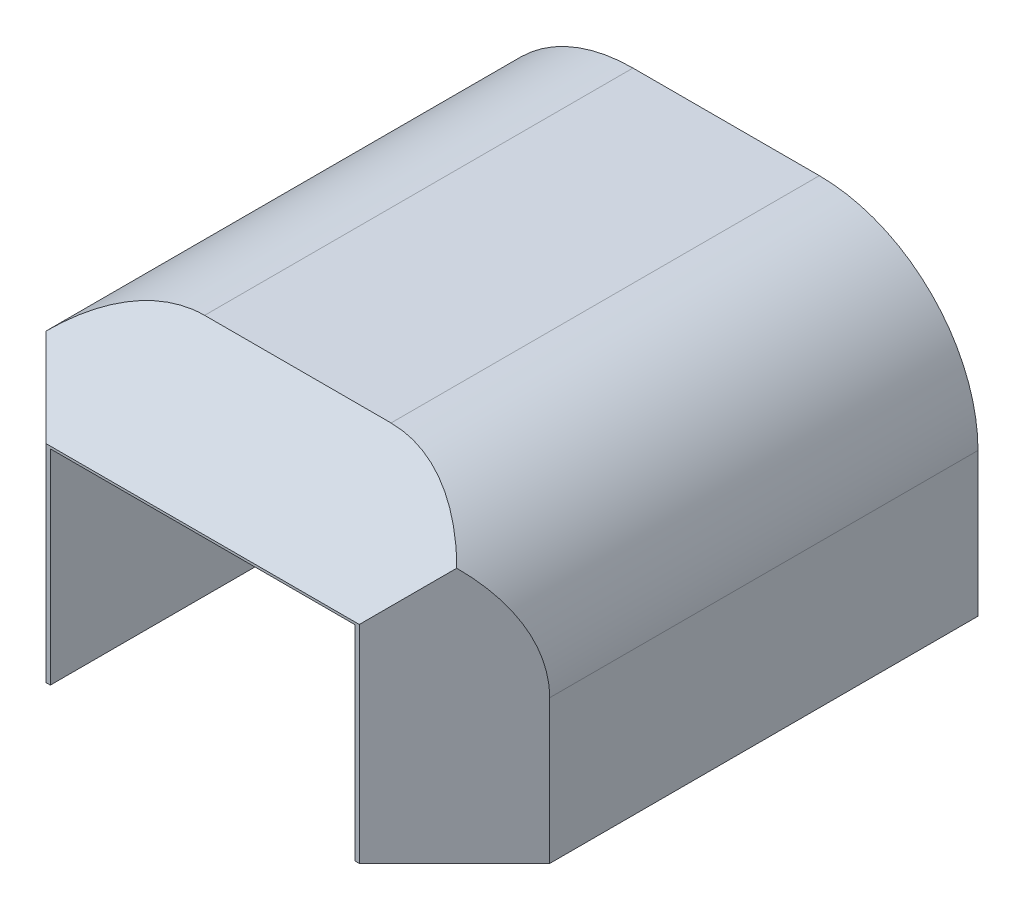
ISO-10303-21;
HEADER;
FILE_DESCRIPTION(('STEP AP214'),'2;1');
FILE_NAME('part.step','',(''),(''),'','','');
FILE_SCHEMA(('AUTOMOTIVE_DESIGN { 1 0 10303 214 1 1 1 1 }'));
ENDSEC;
DATA;
#1=APPLICATION_CONTEXT('core data for automotive mechanical design processes');
#2=APPLICATION_PROTOCOL_DEFINITION('international standard','automotive_design',2000,#1);
#3=PRODUCT_CONTEXT('',#1,'mechanical');
#4=PRODUCT('Part','Part','',(#3));
#5=PRODUCT_RELATED_PRODUCT_CATEGORY('part','',(#4));
#6=PRODUCT_DEFINITION_FORMATION('','',#4);
#7=PRODUCT_DEFINITION_CONTEXT('part definition',#1,'design');
#8=PRODUCT_DEFINITION('design','',#6,#7);
#9=PRODUCT_DEFINITION_SHAPE('','',#8);
#10=(LENGTH_UNIT() NAMED_UNIT(*) SI_UNIT(.MILLI.,.METRE.));
#11=(NAMED_UNIT(*) PLANE_ANGLE_UNIT() SI_UNIT($,.RADIAN.));
#12=(NAMED_UNIT(*) SI_UNIT($,.STERADIAN.) SOLID_ANGLE_UNIT());
#13=UNCERTAINTY_MEASURE_WITH_UNIT(LENGTH_MEASURE(1.E-05),#10,'distance_accuracy_value','');
#14=(GEOMETRIC_REPRESENTATION_CONTEXT(3) GLOBAL_UNCERTAINTY_ASSIGNED_CONTEXT((#13)) GLOBAL_UNIT_ASSIGNED_CONTEXT((#10,
#11,#12)) REPRESENTATION_CONTEXT('',''));
#15=CARTESIAN_POINT('',(0.,0.,0.));
#16=DIRECTION('',(0.,0.,1.));
#17=DIRECTION('',(1.,0.,0.));
#18=AXIS2_PLACEMENT_3D('',#15,#16,#17);
#19=CARTESIAN_POINT('',(0.,0.,16.5));
#20=DIRECTION('',(0.,-1.,0.));
#21=DIRECTION('',(1.,0.,0.));
#22=AXIS2_PLACEMENT_3D('',#19,#20,#21);
#23=PLANE('',#22);
#24=DIRECTION('',(0.,0.,-1.));
#25=VECTOR('',#24,1.);
#26=CARTESIAN_POINT('',(15.875,0.,16.5));
#27=LINE('',#26,#25);
#28=CARTESIAN_POINT('',(15.875,0.,10.5));
#29=VERTEX_POINT('',#28);
#30=CARTESIAN_POINT('',(15.875,0.,-16.5));
#31=VERTEX_POINT('',#30);
#32=EDGE_CURVE('E194',#29,#31,#27,.T.);
#33=ORIENTED_EDGE('',*,*,#32,.F.);
#34=DIRECTION('',(0.707106781186549,0.,-0.707106781186546));
#35=VECTOR('',#34,1.);
#36=CARTESIAN_POINT('',(4.93749999999997,0.,21.4375));
#37=LINE('',#36,#35);
#38=CARTESIAN_POINT('',(9.87499999999998,0.,16.5));
#39=VERTEX_POINT('',#38);
#40=EDGE_CURVE('E208',#29,#39,#37,.F.);
#41=ORIENTED_EDGE('',*,*,#40,.T.);
#42=DIRECTION('',(-1.,0.,0.));
#43=VECTOR('',#42,1.);
#44=CARTESIAN_POINT('',(0.,0.,16.5));
#45=LINE('',#44,#43);
#46=CARTESIAN_POINT('',(9.6,0.,16.5));
#47=VERTEX_POINT('',#46);
#48=EDGE_CURVE('E159',#39,#47,#45,.T.);
#49=ORIENTED_EDGE('',*,*,#48,.T.);
#50=DIRECTION('',(0.,0.,-1.));
#51=VECTOR('',#50,1.);
#52=CARTESIAN_POINT('',(9.6,0.,16.5));
#53=LINE('',#52,#51);
#54=CARTESIAN_POINT('',(9.6,0.,-16.5));
#55=VERTEX_POINT('',#54);
#56=EDGE_CURVE('E168',#47,#55,#53,.T.);
#57=ORIENTED_EDGE('',*,*,#56,.T.);
#58=DIRECTION('',(-1.,0.,0.));
#59=VECTOR('',#58,1.);
#60=CARTESIAN_POINT('',(0.,0.,-16.5));
#61=LINE('',#60,#59);
#62=EDGE_CURVE('E169',#31,#55,#61,.T.);
#63=ORIENTED_EDGE('',*,*,#62,.F.);
#64=EDGE_LOOP('',(#33,#41,#49,#57,#63));
#65=FACE_BOUND('',#64,.T.);
#66=ADVANCED_FACE('F39',(#65),#23,.T.);
#67=CARTESIAN_POINT('',(15.875,0.,16.5));
#68=DIRECTION('',(1.,0.,0.));
#69=DIRECTION('',(0.,0.,-1.));
#70=AXIS2_PLACEMENT_3D('',#67,#68,#69);
#71=PLANE('',#70);
#72=DIRECTION('',(0.,-1.,0.));
#73=VECTOR('',#72,1.);
#74=CARTESIAN_POINT('',(15.875,0.,-16.5));
#75=LINE('',#74,#73);
#76=CARTESIAN_POINT('',(15.875,9.05,-16.5));
#77=VERTEX_POINT('',#76);
#78=EDGE_CURVE('E172',#77,#31,#75,.T.);
#79=ORIENTED_EDGE('',*,*,#78,.F.);
#80=DIRECTION('',(0.,0.,-1.));
#81=VECTOR('',#80,1.);
#82=CARTESIAN_POINT('',(15.875,9.05,16.5));
#83=LINE('',#82,#81);
#84=CARTESIAN_POINT('',(15.875,9.05,10.5));
#85=VERTEX_POINT('',#84);
#86=EDGE_CURVE('E226',#77,#85,#83,.F.);
#87=ORIENTED_EDGE('',*,*,#86,.T.);
#88=DIRECTION('',(0.,-1.,0.));
#89=VECTOR('',#88,1.);
#90=CARTESIAN_POINT('',(15.875,0.,10.5));
#91=LINE('',#90,#89);
#92=EDGE_CURVE('E206',#85,#29,#91,.T.);
#93=ORIENTED_EDGE('',*,*,#92,.T.);
#94=ORIENTED_EDGE('',*,*,#32,.T.);
#95=EDGE_LOOP('',(#79,#87,#93,#94));
#96=FACE_BOUND('',#95,.T.);
#97=ADVANCED_FACE('F277',(#96),#71,.T.);
#98=CARTESIAN_POINT('',(0.,19.05,16.5));
#99=DIRECTION('',(0.,1.,0.));
#100=DIRECTION('',(-1.,0.,0.));
#101=AXIS2_PLACEMENT_3D('',#98,#99,#100);
#102=PLANE('',#101);
#103=DIRECTION('',(1.,0.,0.));
#104=VECTOR('',#103,1.);
#105=CARTESIAN_POINT('',(0.,19.05,10.5));
#106=LINE('',#105,#104);
#107=CARTESIAN_POINT('',(-5.875,19.05,10.5));
#108=VERTEX_POINT('',#107);
#109=CARTESIAN_POINT('',(5.875,19.05,10.5));
#110=VERTEX_POINT('',#109);
#111=EDGE_CURVE('E210',#108,#110,#106,.T.);
#112=ORIENTED_EDGE('',*,*,#111,.T.);
#113=DIRECTION('',(0.,0.,-1.));
#114=VECTOR('',#113,1.);
#115=CARTESIAN_POINT('',(5.875,19.05,16.5));
#116=LINE('',#115,#114);
#117=CARTESIAN_POINT('',(5.875,19.05,-16.5));
#118=VERTEX_POINT('',#117);
#119=EDGE_CURVE('E219',#110,#118,#116,.T.);
#120=ORIENTED_EDGE('',*,*,#119,.T.);
#121=DIRECTION('',(1.,0.,0.));
#122=VECTOR('',#121,1.);
#123=CARTESIAN_POINT('',(0.,19.05,-16.5));
#124=LINE('',#123,#122);
#125=CARTESIAN_POINT('',(-5.875,19.05,-16.5));
#126=VERTEX_POINT('',#125);
#127=EDGE_CURVE('E175',#126,#118,#124,.T.);
#128=ORIENTED_EDGE('',*,*,#127,.F.);
#129=DIRECTION('',(0.,0.,-1.));
#130=VECTOR('',#129,1.);
#131=CARTESIAN_POINT('',(-5.875,19.05,16.5));
#132=LINE('',#131,#130);
#133=EDGE_CURVE('E213',#126,#108,#132,.F.);
#134=ORIENTED_EDGE('',*,*,#133,.T.);
#135=EDGE_LOOP('',(#112,#120,#128,#134));
#136=FACE_BOUND('',#135,.T.);
#137=ADVANCED_FACE('F282',(#136),#102,.T.);
#138=CARTESIAN_POINT('',(-15.875,0.,16.5));
#139=DIRECTION('',(-1.,0.,0.));
#140=DIRECTION('',(0.,0.,1.));
#141=AXIS2_PLACEMENT_3D('',#138,#139,#140);
#142=PLANE('',#141);
#143=DIRECTION('',(0.,1.,0.));
#144=VECTOR('',#143,1.);
#145=CARTESIAN_POINT('',(-15.875,0.,10.5));
#146=LINE('',#145,#144);
#147=CARTESIAN_POINT('',(-15.875,0.,10.5));
#148=VERTEX_POINT('',#147);
#149=CARTESIAN_POINT('',(-15.875,9.05,10.5));
#150=VERTEX_POINT('',#149);
#151=EDGE_CURVE('E197',#148,#150,#146,.T.);
#152=ORIENTED_EDGE('',*,*,#151,.T.);
#153=DIRECTION('',(0.,0.,-1.));
#154=VECTOR('',#153,1.);
#155=CARTESIAN_POINT('',(-15.875,9.05,16.5));
#156=LINE('',#155,#154);
#157=CARTESIAN_POINT('',(-15.875,9.05,-16.5));
#158=VERTEX_POINT('',#157);
#159=EDGE_CURVE('E47',#150,#158,#156,.T.);
#160=ORIENTED_EDGE('',*,*,#159,.T.);
#161=DIRECTION('',(0.,1.,0.));
#162=VECTOR('',#161,1.);
#163=CARTESIAN_POINT('',(-15.875,0.,-16.5));
#164=LINE('',#163,#162);
#165=CARTESIAN_POINT('',(-15.875,0.,-16.5));
#166=VERTEX_POINT('',#165);
#167=EDGE_CURVE('E178',#166,#158,#164,.T.);
#168=ORIENTED_EDGE('',*,*,#167,.F.);
#169=DIRECTION('',(0.,0.,-1.));
#170=VECTOR('',#169,1.);
#171=CARTESIAN_POINT('',(-15.875,0.,16.5));
#172=LINE('',#171,#170);
#173=EDGE_CURVE('E145',#148,#166,#172,.T.);
#174=ORIENTED_EDGE('',*,*,#173,.F.);
#175=EDGE_LOOP('',(#152,#160,#168,#174));
#176=FACE_BOUND('',#175,.T.);
#177=ADVANCED_FACE('F236',(#176),#142,.T.);
#178=CARTESIAN_POINT('',(0.,0.,16.5));
#179=DIRECTION('',(0.,-1.,0.));
#180=DIRECTION('',(1.,0.,0.));
#181=AXIS2_PLACEMENT_3D('',#178,#179,#180);
#182=PLANE('',#181);
#183=DIRECTION('',(-1.,0.,0.));
#184=VECTOR('',#183,1.);
#185=CARTESIAN_POINT('',(0.,0.,16.5));
#186=LINE('',#185,#184);
#187=CARTESIAN_POINT('',(-9.6,0.,16.5));
#188=VERTEX_POINT('',#187);
#189=CARTESIAN_POINT('',(-9.87499999999998,0.,16.5));
#190=VERTEX_POINT('',#189);
#191=EDGE_CURVE('E139',#188,#190,#186,.T.);
#192=ORIENTED_EDGE('',*,*,#191,.T.);
#193=DIRECTION('',(0.707106781186549,0.,0.707106781186546));
#194=VECTOR('',#193,1.);
#195=CARTESIAN_POINT('',(-4.93749999999998,0.,21.4375));
#196=LINE('',#195,#194);
#197=EDGE_CURVE('E204',#190,#148,#196,.F.);
#198=ORIENTED_EDGE('',*,*,#197,.T.);
#199=ORIENTED_EDGE('',*,*,#173,.T.);
#200=DIRECTION('',(-1.,0.,0.));
#201=VECTOR('',#200,1.);
#202=CARTESIAN_POINT('',(0.,0.,-16.5));
#203=LINE('',#202,#201);
#204=CARTESIAN_POINT('',(-9.6,0.,-16.5));
#205=VERTEX_POINT('',#204);
#206=EDGE_CURVE('E142',#205,#166,#203,.T.);
#207=ORIENTED_EDGE('',*,*,#206,.F.);
#208=DIRECTION('',(0.,0.,-1.));
#209=VECTOR('',#208,1.);
#210=CARTESIAN_POINT('',(-9.6,0.,16.5));
#211=LINE('',#210,#209);
#212=EDGE_CURVE('E135',#188,#205,#211,.T.);
#213=ORIENTED_EDGE('',*,*,#212,.F.);
#214=EDGE_LOOP('',(#192,#198,#199,#207,#213));
#215=FACE_BOUND('',#214,.T.);
#216=ADVANCED_FACE('F137',(#215),#182,.T.);
#217=CARTESIAN_POINT('',(-9.6,0.,16.5));
#218=DIRECTION('',(-1.,0.,0.));
#219=DIRECTION('',(0.,0.,1.));
#220=AXIS2_PLACEMENT_3D('',#217,#218,#219);
#221=PLANE('',#220);
#222=DIRECTION('',(0.,1.,0.));
#223=VECTOR('',#222,1.);
#224=CARTESIAN_POINT('',(-9.6,0.,-16.5));
#225=LINE('',#224,#223);
#226=CARTESIAN_POINT('',(-9.6,12.9,-16.5));
#227=VERTEX_POINT('',#226);
#228=EDGE_CURVE('E182',#205,#227,#225,.T.);
#229=ORIENTED_EDGE('',*,*,#228,.T.);
#230=DIRECTION('',(0.,0.,-1.));
#231=VECTOR('',#230,1.);
#232=CARTESIAN_POINT('',(-9.6,12.9,16.5));
#233=LINE('',#232,#231);
#234=CARTESIAN_POINT('',(-9.6,12.9,16.5));
#235=VERTEX_POINT('',#234);
#236=EDGE_CURVE('E146',#235,#227,#233,.T.);
#237=ORIENTED_EDGE('',*,*,#236,.F.);
#238=DIRECTION('',(0.,1.,0.));
#239=VECTOR('',#238,1.);
#240=CARTESIAN_POINT('',(-9.6,0.,16.5));
#241=LINE('',#240,#239);
#242=EDGE_CURVE('E149',#188,#235,#241,.T.);
#243=ORIENTED_EDGE('',*,*,#242,.F.);
#244=ORIENTED_EDGE('',*,*,#212,.T.);
#245=EDGE_LOOP('',(#229,#237,#243,#244));
#246=FACE_BOUND('',#245,.T.);
#247=ADVANCED_FACE('F150',(#246),#221,.F.);
#248=CARTESIAN_POINT('',(0.,12.9,16.5));
#249=DIRECTION('',(0.,1.,0.));
#250=DIRECTION('',(0.,0.,1.));
#251=AXIS2_PLACEMENT_3D('',#248,#249,#250);
#252=PLANE('',#251);
#253=DIRECTION('',(1.,0.,0.));
#254=VECTOR('',#253,1.);
#255=CARTESIAN_POINT('',(0.,12.9,-16.5));
#256=LINE('',#255,#254);
#257=CARTESIAN_POINT('',(9.6,12.9,-16.5));
#258=VERTEX_POINT('',#257);
#259=EDGE_CURVE('E184',#227,#258,#256,.T.);
#260=ORIENTED_EDGE('',*,*,#259,.T.);
#261=DIRECTION('',(0.,0.,-1.));
#262=VECTOR('',#261,1.);
#263=CARTESIAN_POINT('',(9.6,12.9,16.5));
#264=LINE('',#263,#262);
#265=CARTESIAN_POINT('',(9.6,12.9,16.5));
#266=VERTEX_POINT('',#265);
#267=EDGE_CURVE('E189',#266,#258,#264,.T.);
#268=ORIENTED_EDGE('',*,*,#267,.F.);
#269=DIRECTION('',(1.,0.,0.));
#270=VECTOR('',#269,1.);
#271=CARTESIAN_POINT('',(0.,12.9,16.5));
#272=LINE('',#271,#270);
#273=EDGE_CURVE('E154',#235,#266,#272,.T.);
#274=ORIENTED_EDGE('',*,*,#273,.F.);
#275=ORIENTED_EDGE('',*,*,#236,.T.);
#276=EDGE_LOOP('',(#260,#268,#274,#275));
#277=FACE_BOUND('',#276,.T.);
#278=ADVANCED_FACE('F245',(#277),#252,.F.);
#279=CARTESIAN_POINT('',(9.6,0.,16.5));
#280=DIRECTION('',(1.,0.,0.));
#281=DIRECTION('',(0.,1.,0.));
#282=AXIS2_PLACEMENT_3D('',#279,#280,#281);
#283=PLANE('',#282);
#284=DIRECTION('',(0.,-1.,0.));
#285=VECTOR('',#284,1.);
#286=CARTESIAN_POINT('',(9.6,0.,-16.5));
#287=LINE('',#286,#285);
#288=EDGE_CURVE('E161',#258,#55,#287,.T.);
#289=ORIENTED_EDGE('',*,*,#288,.T.);
#290=ORIENTED_EDGE('',*,*,#56,.F.);
#291=DIRECTION('',(0.,-1.,0.));
#292=VECTOR('',#291,1.);
#293=CARTESIAN_POINT('',(9.6,0.,16.5));
#294=LINE('',#293,#292);
#295=EDGE_CURVE('E165',#266,#47,#294,.T.);
#296=ORIENTED_EDGE('',*,*,#295,.F.);
#297=ORIENTED_EDGE('',*,*,#267,.T.);
#298=EDGE_LOOP('',(#289,#290,#296,#297));
#299=FACE_BOUND('',#298,.T.);
#300=ADVANCED_FACE('F252',(#299),#283,.F.);
#301=CARTESIAN_POINT('',(0.,0.,16.5));
#302=DIRECTION('',(0.,0.,1.));
#303=DIRECTION('',(1.,0.,0.));
#304=AXIS2_PLACEMENT_3D('',#301,#302,#303);
#305=PLANE('',#304);
#306=DIRECTION('',(-1.,0.,0.));
#307=VECTOR('',#306,1.);
#308=CARTESIAN_POINT('',(0.,13.05,16.5));
#309=LINE('',#308,#307);
#310=CARTESIAN_POINT('',(9.87499999999998,13.05,16.5));
#311=VERTEX_POINT('',#310);
#312=CARTESIAN_POINT('',(-9.87499999999998,13.05,16.5));
#313=VERTEX_POINT('',#312);
#314=EDGE_CURVE('E199',#311,#313,#309,.T.);
#315=ORIENTED_EDGE('',*,*,#314,.T.);
#316=DIRECTION('',(0.,-1.,0.));
#317=VECTOR('',#316,1.);
#318=CARTESIAN_POINT('',(-9.87499999999998,0.,16.5));
#319=LINE('',#318,#317);
#320=EDGE_CURVE('E158',#313,#190,#319,.T.);
#321=ORIENTED_EDGE('',*,*,#320,.T.);
#322=ORIENTED_EDGE('',*,*,#191,.F.);
#323=ORIENTED_EDGE('',*,*,#242,.T.);
#324=ORIENTED_EDGE('',*,*,#273,.T.);
#325=ORIENTED_EDGE('',*,*,#295,.T.);
#326=ORIENTED_EDGE('',*,*,#48,.F.);
#327=DIRECTION('',(0.,1.,0.));
#328=VECTOR('',#327,1.);
#329=CARTESIAN_POINT('',(9.87499999999998,0.,16.5));
#330=LINE('',#329,#328);
#331=EDGE_CURVE('E201',#39,#311,#330,.T.);
#332=ORIENTED_EDGE('',*,*,#331,.T.);
#333=EDGE_LOOP('',(#315,#321,#322,#323,#324,#325,#326,#332));
#334=FACE_BOUND('',#333,.T.);
#335=ADVANCED_FACE('F156',(#334),#305,.T.);
#336=CARTESIAN_POINT('',(0.,0.,-16.5));
#337=DIRECTION('',(0.,0.,1.));
#338=DIRECTION('',(1.,0.,0.));
#339=AXIS2_PLACEMENT_3D('',#336,#337,#338);
#340=PLANE('',#339);
#341=ORIENTED_EDGE('',*,*,#127,.T.);
#342=CARTESIAN_POINT('',(5.875,9.05,-16.5));
#343=DIRECTION('',(0.,0.,1.));
#344=DIRECTION('',(1.,0.,0.));
#345=AXIS2_PLACEMENT_3D('',#342,#343,#344);
#346=CIRCLE('',#345,10.);
#347=EDGE_CURVE('E224',#118,#77,#346,.F.);
#348=ORIENTED_EDGE('',*,*,#347,.T.);
#349=ORIENTED_EDGE('',*,*,#78,.T.);
#350=ORIENTED_EDGE('',*,*,#62,.T.);
#351=ORIENTED_EDGE('',*,*,#288,.F.);
#352=ORIENTED_EDGE('',*,*,#259,.F.);
#353=ORIENTED_EDGE('',*,*,#228,.F.);
#354=ORIENTED_EDGE('',*,*,#206,.T.);
#355=ORIENTED_EDGE('',*,*,#167,.T.);
#356=CARTESIAN_POINT('',(-5.875,9.05,-16.5));
#357=DIRECTION('',(0.,0.,1.));
#358=DIRECTION('',(1.,0.,0.));
#359=AXIS2_PLACEMENT_3D('',#356,#357,#358);
#360=CIRCLE('',#359,10.);
#361=EDGE_CURVE('E222',#158,#126,#360,.F.);
#362=ORIENTED_EDGE('',*,*,#361,.T.);
#363=EDGE_LOOP('',(#341,#348,#349,#350,#351,#352,#353,#354,#355,#362));
#364=FACE_BOUND('',#363,.T.);
#365=ADVANCED_FACE('F240',(#364),#340,.F.);
#366=CARTESIAN_POINT('',(15.875,0.,10.5));
#367=DIRECTION('',(-0.707106781186546,0.,-0.707106781186549));
#368=DIRECTION('',(0.,-1.,0.));
#369=AXIS2_PLACEMENT_3D('',#366,#367,#368);
#370=PLANE('',#369);
#371=ORIENTED_EDGE('',*,*,#92,.F.);
#372=CARTESIAN_POINT('',(5.875,9.05,20.5));
#373=DIRECTION('',(-0.707106781186546,0.,-0.707106781186549));
#374=DIRECTION('',(0.707106781186549,0.,-0.707106781186546));
#375=AXIS2_PLACEMENT_3D('',#372,#373,#374);
#376=ELLIPSE('',#375,14.1421356237309,10.);
#377=CARTESIAN_POINT('',(12.9460678118655,16.1210678118655,13.4289321881345));
#378=VERTEX_POINT('',#377);
#379=EDGE_CURVE('E228',#85,#378,#376,.F.);
#380=ORIENTED_EDGE('',*,*,#379,.T.);
#381=DIRECTION('',(0.577350269189626,0.577350269189626,-0.577350269189624));
#382=VECTOR('',#381,1.);
#383=CARTESIAN_POINT('',(10.5833333333333,13.7583333333333,15.7916666666667));
#384=LINE('',#383,#382);
#385=EDGE_CURVE('E173',#311,#378,#384,.T.);
#386=ORIENTED_EDGE('',*,*,#385,.F.);
#387=ORIENTED_EDGE('',*,*,#331,.F.);
#388=ORIENTED_EDGE('',*,*,#40,.F.);
#389=EDGE_LOOP('',(#371,#380,#386,#387,#388));
#390=FACE_BOUND('',#389,.T.);
#391=ADVANCED_FACE('F259',(#390),#370,.F.);
#392=CARTESIAN_POINT('',(0.,19.05,10.5));
#393=DIRECTION('',(0.,-0.707106781186546,-0.707106781186549));
#394=DIRECTION('',(1.,0.,0.));
#395=AXIS2_PLACEMENT_3D('',#392,#393,#394);
#396=PLANE('',#395);
#397=ORIENTED_EDGE('',*,*,#385,.T.);
#398=CARTESIAN_POINT('',(5.875,9.05,20.5));
#399=DIRECTION('',(0.,-0.707106781186546,-0.707106781186549));
#400=DIRECTION('',(0.,0.707106781186549,-0.707106781186546));
#401=AXIS2_PLACEMENT_3D('',#398,#399,#400);
#402=ELLIPSE('',#401,14.1421356237309,10.);
#403=EDGE_CURVE('E231',#378,#110,#402,.F.);
#404=ORIENTED_EDGE('',*,*,#403,.T.);
#405=ORIENTED_EDGE('',*,*,#111,.F.);
#406=CARTESIAN_POINT('',(-5.875,9.05,20.5));
#407=DIRECTION('',(0.,-0.707106781186546,-0.707106781186549));
#408=DIRECTION('',(0.,0.707106781186549,-0.707106781186546));
#409=AXIS2_PLACEMENT_3D('',#406,#407,#408);
#410=ELLIPSE('',#409,14.1421356237309,10.);
#411=CARTESIAN_POINT('',(-12.9460678118655,16.1210678118655,13.4289321881345));
#412=VERTEX_POINT('',#411);
#413=EDGE_CURVE('E60',#108,#412,#410,.F.);
#414=ORIENTED_EDGE('',*,*,#413,.T.);
#415=DIRECTION('',(0.577350269189626,-0.577350269189626,0.577350269189624));
#416=VECTOR('',#415,1.);
#417=CARTESIAN_POINT('',(-10.5833333333333,13.7583333333333,15.7916666666667));
#418=LINE('',#417,#416);
#419=EDGE_CURVE('E214',#313,#412,#418,.F.);
#420=ORIENTED_EDGE('',*,*,#419,.F.);
#421=ORIENTED_EDGE('',*,*,#314,.F.);
#422=EDGE_LOOP('',(#397,#404,#405,#414,#420,#421));
#423=FACE_BOUND('',#422,.T.);
#424=ADVANCED_FACE('F264',(#423),#396,.F.);
#425=CARTESIAN_POINT('',(-15.875,0.,10.5));
#426=DIRECTION('',(0.707106781186546,0.,-0.707106781186549));
#427=DIRECTION('',(0.,1.,0.));
#428=AXIS2_PLACEMENT_3D('',#425,#426,#427);
#429=PLANE('',#428);
#430=ORIENTED_EDGE('',*,*,#419,.T.);
#431=CARTESIAN_POINT('',(-5.875,9.05,20.5));
#432=DIRECTION('',(0.707106781186546,0.,-0.707106781186549));
#433=DIRECTION('',(-0.707106781186549,0.,-0.707106781186546));
#434=AXIS2_PLACEMENT_3D('',#431,#432,#433);
#435=ELLIPSE('',#434,14.1421356237309,10.);
#436=EDGE_CURVE('E11',#412,#150,#435,.F.);
#437=ORIENTED_EDGE('',*,*,#436,.T.);
#438=ORIENTED_EDGE('',*,*,#151,.F.);
#439=ORIENTED_EDGE('',*,*,#197,.F.);
#440=ORIENTED_EDGE('',*,*,#320,.F.);
#441=EDGE_LOOP('',(#430,#437,#438,#439,#440));
#442=FACE_BOUND('',#441,.T.);
#443=ADVANCED_FACE('F263',(#442),#429,.F.);
#444=CARTESIAN_POINT('',(5.875,9.05,16.5));
#445=DIRECTION('',(0.,0.,-1.));
#446=DIRECTION('',(-1.,0.,0.));
#447=AXIS2_PLACEMENT_3D('',#444,#445,#446);
#448=CYLINDRICAL_SURFACE('',#447,10.);
#449=ORIENTED_EDGE('',*,*,#379,.F.);
#450=ORIENTED_EDGE('',*,*,#86,.F.);
#451=ORIENTED_EDGE('',*,*,#347,.F.);
#452=ORIENTED_EDGE('',*,*,#119,.F.);
#453=ORIENTED_EDGE('',*,*,#403,.F.);
#454=EDGE_LOOP('',(#449,#450,#451,#452,#453));
#455=FACE_BOUND('',#454,.T.);
#456=ADVANCED_FACE('F272',(#455),#448,.T.);
#457=CARTESIAN_POINT('',(-5.875,9.05,16.5));
#458=DIRECTION('',(0.,0.,-1.));
#459=DIRECTION('',(-1.,0.,0.));
#460=AXIS2_PLACEMENT_3D('',#457,#458,#459);
#461=CYLINDRICAL_SURFACE('',#460,10.);
#462=ORIENTED_EDGE('',*,*,#413,.F.);
#463=ORIENTED_EDGE('',*,*,#133,.F.);
#464=ORIENTED_EDGE('',*,*,#361,.F.);
#465=ORIENTED_EDGE('',*,*,#159,.F.);
#466=ORIENTED_EDGE('',*,*,#436,.F.);
#467=EDGE_LOOP('',(#462,#463,#464,#465,#466));
#468=FACE_BOUND('',#467,.T.);
#469=ADVANCED_FACE('F41',(#468),#461,.T.);
#470=CLOSED_SHELL('',(#66,#97,#137,#177,#216,#247,#278,#300,#335,#365,#391,#424,#443,#456,#469));
#471=MANIFOLD_SOLID_BREP('B2',#470);
#472=ADVANCED_BREP_SHAPE_REPRESENTATION('',(#18,#471),#14);
#473=SHAPE_DEFINITION_REPRESENTATION(#9,#472);
ENDSEC;
END-ISO-10303-21;
